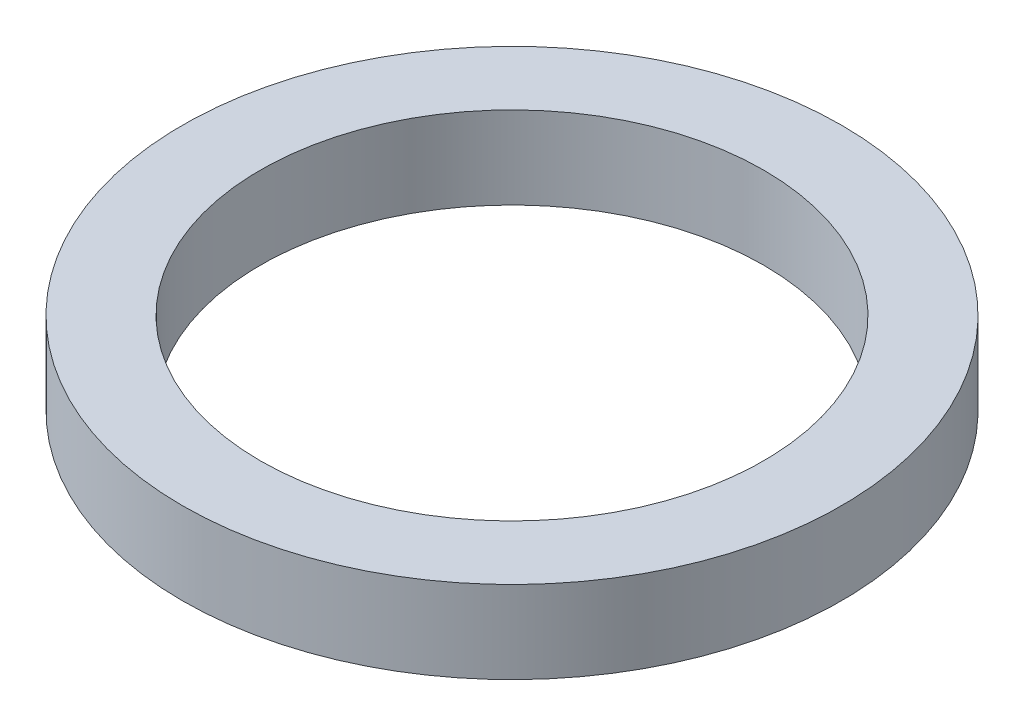
ISO-10303-21;
HEADER;
FILE_DESCRIPTION(('STEP AP214'),'2;1');
FILE_NAME('part.step','',(''),(''),'','','');
FILE_SCHEMA(('AUTOMOTIVE_DESIGN { 1 0 10303 214 1 1 1 1 }'));
ENDSEC;
DATA;
#1=APPLICATION_CONTEXT('core data for automotive mechanical design processes');
#2=APPLICATION_PROTOCOL_DEFINITION('international standard','automotive_design',2000,#1);
#3=PRODUCT_CONTEXT('',#1,'mechanical');
#4=PRODUCT('Part','Part','',(#3));
#5=PRODUCT_RELATED_PRODUCT_CATEGORY('part','',(#4));
#6=PRODUCT_DEFINITION_FORMATION('','',#4);
#7=PRODUCT_DEFINITION_CONTEXT('part definition',#1,'design');
#8=PRODUCT_DEFINITION('design','',#6,#7);
#9=PRODUCT_DEFINITION_SHAPE('','',#8);
#10=(LENGTH_UNIT() NAMED_UNIT(*) SI_UNIT(.MILLI.,.METRE.));
#11=(NAMED_UNIT(*) PLANE_ANGLE_UNIT() SI_UNIT($,.RADIAN.));
#12=(NAMED_UNIT(*) SI_UNIT($,.STERADIAN.) SOLID_ANGLE_UNIT());
#13=UNCERTAINTY_MEASURE_WITH_UNIT(LENGTH_MEASURE(1.E-05),#10,'distance_accuracy_value','');
#14=(GEOMETRIC_REPRESENTATION_CONTEXT(3) GLOBAL_UNCERTAINTY_ASSIGNED_CONTEXT((#13)) GLOBAL_UNIT_ASSIGNED_CONTEXT((#10,
#11,#12)) REPRESENTATION_CONTEXT('',''));
#15=CARTESIAN_POINT('',(0.,0.,0.));
#16=DIRECTION('',(0.,0.,1.));
#17=DIRECTION('',(1.,0.,0.));
#18=AXIS2_PLACEMENT_3D('',#15,#16,#17);
#19=CARTESIAN_POINT('',(0.,9.,0.));
#20=DIRECTION('',(0.,1.,0.));
#21=DIRECTION('',(0.,0.,1.));
#22=AXIS2_PLACEMENT_3D('',#19,#20,#21);
#23=PLANE('',#22);
#24=CARTESIAN_POINT('',(0.,9.,0.));
#25=DIRECTION('',(0.,1.,0.));
#26=DIRECTION('',(0.,0.,1.));
#27=AXIS2_PLACEMENT_3D('',#24,#25,#26);
#28=CIRCLE('',#27,36.);
#29=CARTESIAN_POINT('',(0.,9.,36.));
#30=VERTEX_POINT('',#29);
#31=EDGE_CURVE('E10',#30,#30,#28,.T.);
#32=ORIENTED_EDGE('',*,*,#31,.T.);
#33=EDGE_LOOP('',(#32));
#34=FACE_BOUND('',#33,.T.);
#35=CARTESIAN_POINT('',(0.,9.,0.));
#36=DIRECTION('',(0.,1.,0.));
#37=DIRECTION('',(0.,0.,1.));
#38=AXIS2_PLACEMENT_3D('',#35,#36,#37);
#39=CIRCLE('',#38,27.5);
#40=CARTESIAN_POINT('',(0.,9.,27.5));
#41=VERTEX_POINT('',#40);
#42=EDGE_CURVE('E44',#41,#41,#39,.T.);
#43=ORIENTED_EDGE('',*,*,#42,.F.);
#44=EDGE_LOOP('',(#43));
#45=FACE_BOUND('',#44,.T.);
#46=ADVANCED_FACE('F33',(#34,#45),#23,.T.);
#47=CARTESIAN_POINT('',(0.,0.,0.));
#48=DIRECTION('',(0.,1.,0.));
#49=DIRECTION('',(0.,0.,1.));
#50=AXIS2_PLACEMENT_3D('',#47,#48,#49);
#51=PLANE('',#50);
#52=CARTESIAN_POINT('',(0.,0.,0.));
#53=DIRECTION('',(0.,1.,0.));
#54=DIRECTION('',(0.,0.,1.));
#55=AXIS2_PLACEMENT_3D('',#52,#53,#54);
#56=CIRCLE('',#55,36.);
#57=CARTESIAN_POINT('',(0.,0.,36.));
#58=VERTEX_POINT('',#57);
#59=EDGE_CURVE('E37',#58,#58,#56,.T.);
#60=ORIENTED_EDGE('',*,*,#59,.F.);
#61=EDGE_LOOP('',(#60));
#62=FACE_BOUND('',#61,.T.);
#63=CARTESIAN_POINT('',(0.,0.,0.));
#64=DIRECTION('',(0.,1.,0.));
#65=DIRECTION('',(0.,0.,1.));
#66=AXIS2_PLACEMENT_3D('',#63,#64,#65);
#67=CIRCLE('',#66,27.5);
#68=CARTESIAN_POINT('',(0.,0.,27.5));
#69=VERTEX_POINT('',#68);
#70=EDGE_CURVE('E46',#69,#69,#67,.T.);
#71=ORIENTED_EDGE('',*,*,#70,.T.);
#72=EDGE_LOOP('',(#71));
#73=FACE_BOUND('',#72,.T.);
#74=ADVANCED_FACE('F56',(#62,#73),#51,.F.);
#75=CARTESIAN_POINT('',(0.,9.,0.));
#76=DIRECTION('',(0.,-1.,0.));
#77=DIRECTION('',(0.,0.,-1.));
#78=AXIS2_PLACEMENT_3D('',#75,#76,#77);
#79=CYLINDRICAL_SURFACE('',#78,36.);
#80=ORIENTED_EDGE('',*,*,#31,.F.);
#81=EDGE_LOOP('',(#80));
#82=FACE_BOUND('',#81,.T.);
#83=ORIENTED_EDGE('',*,*,#59,.T.);
#84=EDGE_LOOP('',(#83));
#85=FACE_BOUND('',#84,.T.);
#86=ADVANCED_FACE('F35',(#82,#85),#79,.T.);
#87=CARTESIAN_POINT('',(0.,9.,0.));
#88=DIRECTION('',(0.,-1.,0.));
#89=DIRECTION('',(0.,0.,-1.));
#90=AXIS2_PLACEMENT_3D('',#87,#88,#89);
#91=CYLINDRICAL_SURFACE('',#90,27.5);
#92=ORIENTED_EDGE('',*,*,#42,.T.);
#93=EDGE_LOOP('',(#92));
#94=FACE_BOUND('',#93,.T.);
#95=ORIENTED_EDGE('',*,*,#70,.F.);
#96=EDGE_LOOP('',(#95));
#97=FACE_BOUND('',#96,.T.);
#98=ADVANCED_FACE('F52',(#94,#97),#91,.F.);
#99=CLOSED_SHELL('',(#46,#74,#86,#98));
#100=MANIFOLD_SOLID_BREP('B2',#99);
#101=ADVANCED_BREP_SHAPE_REPRESENTATION('',(#18,#100),#14);
#102=SHAPE_DEFINITION_REPRESENTATION(#9,#101);
ENDSEC;
END-ISO-10303-21;
